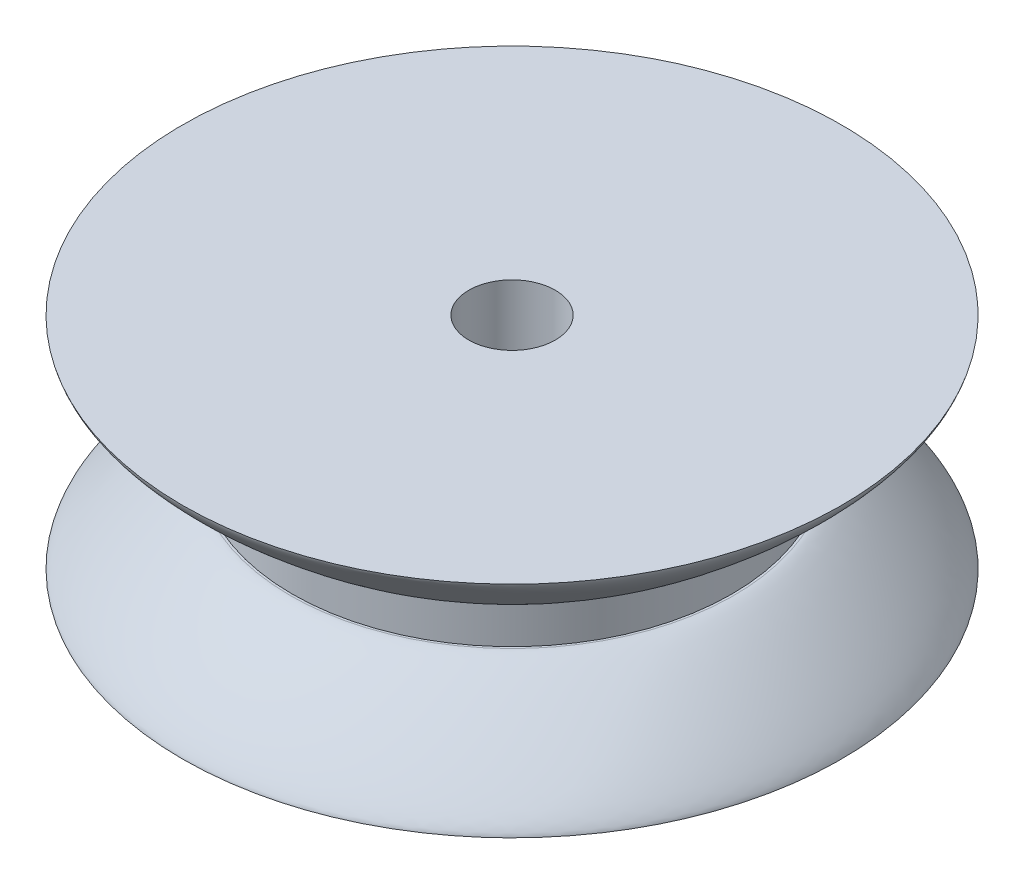
ISO-10303-21;
HEADER;
FILE_DESCRIPTION(('STEP AP214'),'2;1');
FILE_NAME('part.step','',(''),(''),'','','');
FILE_SCHEMA(('AUTOMOTIVE_DESIGN { 1 0 10303 214 1 1 1 1 }'));
ENDSEC;
DATA;
#1=APPLICATION_CONTEXT('core data for automotive mechanical design processes');
#2=APPLICATION_PROTOCOL_DEFINITION('international standard','automotive_design',2000,#1);
#3=PRODUCT_CONTEXT('',#1,'mechanical');
#4=PRODUCT('Part','Part','',(#3));
#5=PRODUCT_RELATED_PRODUCT_CATEGORY('part','',(#4));
#6=PRODUCT_DEFINITION_FORMATION('','',#4);
#7=PRODUCT_DEFINITION_CONTEXT('part definition',#1,'design');
#8=PRODUCT_DEFINITION('design','',#6,#7);
#9=PRODUCT_DEFINITION_SHAPE('','',#8);
#10=(LENGTH_UNIT() NAMED_UNIT(*) SI_UNIT(.MILLI.,.METRE.));
#11=(NAMED_UNIT(*) PLANE_ANGLE_UNIT() SI_UNIT($,.RADIAN.));
#12=(NAMED_UNIT(*) SI_UNIT($,.STERADIAN.) SOLID_ANGLE_UNIT());
#13=UNCERTAINTY_MEASURE_WITH_UNIT(LENGTH_MEASURE(1.E-05),#10,'distance_accuracy_value','');
#14=(GEOMETRIC_REPRESENTATION_CONTEXT(3) GLOBAL_UNCERTAINTY_ASSIGNED_CONTEXT((#13)) GLOBAL_UNIT_ASSIGNED_CONTEXT((#10,
#11,#12)) REPRESENTATION_CONTEXT('',''));
#15=CARTESIAN_POINT('',(0.,0.,0.));
#16=DIRECTION('',(0.,0.,1.));
#17=DIRECTION('',(1.,0.,0.));
#18=AXIS2_PLACEMENT_3D('',#15,#16,#17);
#19=CARTESIAN_POINT('',(0.,5.08,0.));
#20=DIRECTION('',(0.,-1.,0.));
#21=DIRECTION('',(0.,0.,-1.));
#22=AXIS2_PLACEMENT_3D('',#19,#20,#21);
#23=CYLINDRICAL_SURFACE('',#22,1.);
#24=CARTESIAN_POINT('',(0.,5.08,0.));
#25=DIRECTION('',(0.,1.,0.));
#26=DIRECTION('',(0.,0.,1.));
#27=AXIS2_PLACEMENT_3D('',#24,#25,#26);
#28=CIRCLE('',#27,1.);
#29=CARTESIAN_POINT('',(0.,5.08,1.));
#30=VERTEX_POINT('',#29);
#31=EDGE_CURVE('E82',#30,#30,#28,.T.);
#32=ORIENTED_EDGE('',*,*,#31,.T.);
#33=EDGE_LOOP('',(#32));
#34=FACE_BOUND('',#33,.T.);
#35=CARTESIAN_POINT('',(0.,0.,0.));
#36=DIRECTION('',(0.,1.,0.));
#37=DIRECTION('',(0.,0.,1.));
#38=AXIS2_PLACEMENT_3D('',#35,#36,#37);
#39=CIRCLE('',#38,1.);
#40=CARTESIAN_POINT('',(0.,0.,1.));
#41=VERTEX_POINT('',#40);
#42=EDGE_CURVE('E88',#41,#41,#39,.T.);
#43=ORIENTED_EDGE('',*,*,#42,.F.);
#44=EDGE_LOOP('',(#43));
#45=FACE_BOUND('',#44,.T.);
#46=ADVANCED_FACE('F61',(#34,#45),#23,.F.);
#47=CARTESIAN_POINT('',(0.,5.08,0.));
#48=DIRECTION('',(0.,-1.,0.));
#49=DIRECTION('',(0.,0.,-1.));
#50=AXIS2_PLACEMENT_3D('',#47,#48,#49);
#51=CYLINDRICAL_SURFACE('',#50,5.08);
#52=CARTESIAN_POINT('',(0.,3.048,0.));
#53=DIRECTION('',(0.,1.,0.));
#54=DIRECTION('',(0.,0.,1.));
#55=AXIS2_PLACEMENT_3D('',#52,#53,#54);
#56=CIRCLE('',#55,5.08);
#57=CARTESIAN_POINT('',(0.,3.048,5.08));
#58=VERTEX_POINT('',#57);
#59=EDGE_CURVE('E205',#58,#58,#56,.T.);
#60=ORIENTED_EDGE('',*,*,#59,.F.);
#61=EDGE_LOOP('',(#60));
#62=FACE_BOUND('',#61,.T.);
#63=CARTESIAN_POINT('',(0.,2.032,0.));
#64=DIRECTION('',(0.,1.,0.));
#65=DIRECTION('',(0.,0.,1.));
#66=AXIS2_PLACEMENT_3D('',#63,#64,#65);
#67=CIRCLE('',#66,5.08);
#68=CARTESIAN_POINT('',(0.,2.032,5.08));
#69=VERTEX_POINT('',#68);
#70=EDGE_CURVE('E97',#69,#69,#67,.T.);
#71=ORIENTED_EDGE('',*,*,#70,.T.);
#72=EDGE_LOOP('',(#71));
#73=FACE_BOUND('',#72,.T.);
#74=ADVANCED_FACE('F211',(#62,#73),#51,.T.);
#75=CARTESIAN_POINT('',(0.,5.08,0.));
#76=DIRECTION('',(0.,1.,0.));
#77=DIRECTION('',(0.,0.,1.));
#78=AXIS2_PLACEMENT_3D('',#75,#76,#77);
#79=PLANE('',#78);
#80=ORIENTED_EDGE('',*,*,#31,.F.);
#81=EDGE_LOOP('',(#80));
#82=FACE_BOUND('',#81,.T.);
#83=CARTESIAN_POINT('',(0.,5.08,7.62));
#84=CARTESIAN_POINT('',(-0.997455661202278,5.08,7.62));
#85=CARTESIAN_POINT('',(-1.99451888465095,5.08,7.42167179379677));
#86=CARTESIAN_POINT('',(-3.83757662459304,5.08,6.65825228167523));
#87=CARTESIAN_POINT('',(-4.68284601067309,5.08,6.0934613346099));
#88=CARTESIAN_POINT('',(-6.09346133460993,5.08,4.68284601067305));
#89=CARTESIAN_POINT('',(-6.65825228167582,5.08,3.83757662459302));
#90=CARTESIAN_POINT('',(-7.4216717937962,5.08,1.99451888465093));
#91=CARTESIAN_POINT('',(-7.61999999999942,5.08000000000029,0.997455661201066));
#92=CARTESIAN_POINT('',(-7.62000000000058,5.07999999999971,-0.997455661201042));
#93=CARTESIAN_POINT('',(-7.42167179379677,5.08,-1.99451888465066));
#94=CARTESIAN_POINT('',(-6.65825228167523,5.08,-3.83757662459333));
#95=CARTESIAN_POINT('',(-6.09346133461007,5.08,-4.6828460106735));
#96=CARTESIAN_POINT('',(-4.68284601067292,5.08,-6.09346133460948));
#97=CARTESIAN_POINT('',(-3.83757662459366,5.08,-6.65825228167524));
#98=CARTESIAN_POINT('',(-1.99451888465029,5.08,-7.42167179379677));
#99=CARTESIAN_POINT('',(-0.997455661201052,5.08,-7.62));
#100=CARTESIAN_POINT('',(0.997455661201053,5.08,-7.62));
#101=CARTESIAN_POINT('',(1.99451888465045,5.08,-7.42167179379618));
#102=CARTESIAN_POINT('',(3.83757662459354,5.08,-6.65825228167582));
#103=CARTESIAN_POINT('',(4.68284601067291,5.08,-6.0934613346092));
#104=CARTESIAN_POINT('',(6.09346133461006,5.08,-4.6828460106738));
#105=CARTESIAN_POINT('',(6.65825228167538,5.08,-3.83757662459364));
#106=CARTESIAN_POINT('',(7.42167179379663,5.08,-1.99451888465033));
#107=CARTESIAN_POINT('',(7.62,5.08,-0.997455661201052));
#108=CARTESIAN_POINT('',(7.62,5.08,0.997455661201052));
#109=CARTESIAN_POINT('',(7.42167179379692,5.08,1.99451888465091));
#110=CARTESIAN_POINT('',(6.65825228167509,5.08,3.83757662459306));
#111=CARTESIAN_POINT('',(6.09346133460955,5.08,4.68284601067343));
#112=CARTESIAN_POINT('',(4.68284601067343,5.08,6.09346133460955));
#113=CARTESIAN_POINT('',(3.83757662459306,5.08,6.65825228167568));
#114=CARTESIAN_POINT('',(1.99451888465091,5.08,7.42167179379634));
#115=CARTESIAN_POINT('',(0.997455661202277,5.08,7.62));
#116=CARTESIAN_POINT('',(0.,5.08,7.62));
#117=(BOUNDED_CURVE() B_SPLINE_CURVE(3,(#83,#84,#85,#86,#87,#88,#89,#90,#91,#92,#93,#94,#95,#96,
#97,#98,#99,#100,#101,#102,#103,#104,#105,#106,#107,#108,#109,#110,#111,#112,#113,#114,#115,
#116),.UNSPECIFIED.,.T.,.F.) B_SPLINE_CURVE_WITH_KNOTS((4,2,2,2,2,2,2,2,2,2,2,2,2,2,2,2,4),(0.,
0.392699081698725,0.785398163397448,1.17809724509617,1.5707963267949,1.96349540849362,
2.35619449019234,2.74889357189107,3.14159265358979,3.53429173528852,3.92699081698724,
4.31968989868597,4.71238898038469,5.10508806208341,5.49778714378214,5.89048622548086,
6.28318530717959),
.UNSPECIFIED.) CURVE() GEOMETRIC_REPRESENTATION_ITEM() RATIONAL_B_SPLINE_CURVE((1.,1.,1.,1.,1.,
1.,1.,1.,1.,1.,1.,1.,1.,1.,1.,1.,1.,1.,1.,1.,1.,1.,1.,1.,1.,1.,1.,1.,1.,1.,1.,1.,1.,1.)) REPRESENTATION_ITEM(''));
#118=CARTESIAN_POINT('',(0.,5.08,7.62));
#119=VERTEX_POINT('',#118);
#120=EDGE_CURVE('E133',#119,#119,#117,.F.);
#121=ORIENTED_EDGE('',*,*,#120,.T.);
#122=EDGE_LOOP('',(#121));
#123=FACE_BOUND('',#122,.T.);
#124=ADVANCED_FACE('F119',(#82,#123),#79,.T.);
#125=CARTESIAN_POINT('',(0.,0.,0.));
#126=DIRECTION('',(0.,1.,0.));
#127=DIRECTION('',(0.,0.,1.));
#128=AXIS2_PLACEMENT_3D('',#125,#126,#127);
#129=PLANE('',#128);
#130=ORIENTED_EDGE('',*,*,#42,.T.);
#131=EDGE_LOOP('',(#130));
#132=FACE_BOUND('',#131,.T.);
#133=CARTESIAN_POINT('',(0.,0.,7.62));
#134=CARTESIAN_POINT('',(0.997455661201053,0.,7.62));
#135=CARTESIAN_POINT('',(1.99451888465103,0.,7.42167179379618));
#136=CARTESIAN_POINT('',(3.83757662459295,0.,6.65825228167582));
#137=CARTESIAN_POINT('',(4.68284601067291,-1.0923684005759E-13,6.09346133460949));
#138=CARTESIAN_POINT('',(6.09346133461006,1.0923684005759E-13,4.68284601067351));
#139=CARTESIAN_POINT('',(6.65825228167538,0.,3.83757662459335));
#140=CARTESIAN_POINT('',(7.42167179379663,0.,1.99451888465062));
#141=CARTESIAN_POINT('',(7.62,0.,0.997455661201052));
#142=CARTESIAN_POINT('',(7.62,0.,-0.997455661201053));
#143=CARTESIAN_POINT('',(7.42167179379692,1.09128419840217E-13,-1.99451888465047));
#144=CARTESIAN_POINT('',(6.65825228167509,-1.09345260274714E-13,-3.83757662459349));
#145=CARTESIAN_POINT('',(6.09346133460955,0.,-4.68284601067343));
#146=CARTESIAN_POINT('',(4.68284601067343,0.,-6.09346133460955));
#147=CARTESIAN_POINT('',(3.83757662459291,0.,-6.65825228167538));
#148=CARTESIAN_POINT('',(1.99451888465106,0.,-7.42167179379663));
#149=CARTESIAN_POINT('',(0.997455661202278,0.,-7.62));
#150=CARTESIAN_POINT('',(-0.997455661202278,0.,-7.62));
#151=CARTESIAN_POINT('',(-1.99451888464989,0.,-7.42167179379721));
#152=CARTESIAN_POINT('',(-3.83757662459408,0.,-6.6582522816748));
#153=CARTESIAN_POINT('',(-4.6828460106743,0.,-6.09346133460868));
#154=CARTESIAN_POINT('',(-6.09346133460868,0.,-4.68284601067431));
#155=CARTESIAN_POINT('',(-6.6582522816748,-1.09128419840217E-13,-3.83757662459408));
#156=CARTESIAN_POINT('',(-7.42167179379721,1.09345260274714E-13,-1.99451888464989));
#157=CARTESIAN_POINT('',(-7.62,0.,-0.997455661202195));
#158=CARTESIAN_POINT('',(-7.62,0.,0.997455661202184));
#159=CARTESIAN_POINT('',(-7.4216717937972,0.,1.99451888464975));
#160=CARTESIAN_POINT('',(-6.6582522816748,0.,3.83757662459423));
#161=CARTESIAN_POINT('',(-6.09346133460978,0.,4.68284601067321));
#162=CARTESIAN_POINT('',(-4.68284601067321,0.,6.09346133460977));
#163=CARTESIAN_POINT('',(-3.83757662459395,0.,6.65825228167554));
#164=CARTESIAN_POINT('',(-1.99451888465,0.,7.42167179379648));
#165=CARTESIAN_POINT('',(-0.997455661201052,0.,7.62));
#166=CARTESIAN_POINT('',(0.,0.,7.62));
#167=(BOUNDED_CURVE() B_SPLINE_CURVE(3,(#133,#134,#135,#136,#137,#138,#139,#140,#141,#142,#143,
#144,#145,#146,#147,#148,#149,#150,#151,#152,#153,#154,#155,#156,#157,#158,#159,#160,#161,#162,
#163,#164,#165,#166),.UNSPECIFIED.,.T.,.F.) B_SPLINE_CURVE_WITH_KNOTS((4,2,2,2,2,2,2,2,2,2,2,2,
2,2,2,2,4),(-3.14159265358979,-2.74889357189107,-2.35619449019234,-1.96349540849362,
-1.5707963267949,-1.17809724509617,-0.785398163397448,-0.392699081698724,0.,0.392699081698724,
0.785398163397448,1.17809724509617,1.5707963267949,1.96349540849362,2.35619449019234,
2.74889357189107,3.14159265358979),
.UNSPECIFIED.) CURVE() GEOMETRIC_REPRESENTATION_ITEM() RATIONAL_B_SPLINE_CURVE((1.,1.,1.,1.,1.,
1.,1.,1.,1.,1.,1.,1.,1.,1.,1.,1.,1.,1.,1.,1.,1.,1.,1.,1.,1.,1.,1.,1.,1.,1.,1.,1.,1.,1.)) REPRESENTATION_ITEM(''));
#168=CARTESIAN_POINT('',(0.,0.,7.62));
#169=VERTEX_POINT('',#168);
#170=EDGE_CURVE('E94',#169,#169,#167,.T.);
#171=ORIENTED_EDGE('',*,*,#170,.F.);
#172=EDGE_LOOP('',(#171));
#173=FACE_BOUND('',#172,.T.);
#174=ADVANCED_FACE('F118',(#132,#173),#129,.F.);
#175=CARTESIAN_POINT('',(0.,2.032,0.));
#176=DIRECTION('',(0.,1.,0.));
#177=DIRECTION('',(0.,0.,1.));
#178=AXIS2_PLACEMENT_3D('',#175,#176,#177);
#179=PLANE('',#178);
#180=CARTESIAN_POINT('',(0.,2.032,5.13131842133229));
#181=CARTESIAN_POINT('',(-0.671688006401986,2.032,5.13131842133229));
#182=CARTESIAN_POINT('',(-1.34311174468509,2.032,4.99776393603555));
#183=CARTESIAN_POINT('',(-2.58422934738221,2.032,4.48367619249852));
#184=CARTESIAN_POINT('',(-3.15343490798277,2.032,4.10334519631996));
#185=CARTESIAN_POINT('',(-4.10334519632026,2.032,3.15343490798306));
#186=CARTESIAN_POINT('',(-4.48367619249822,2.032,2.58422934738254));
#187=CARTESIAN_POINT('',(-4.99776393603584,2.032,1.34311174468479));
#188=CARTESIAN_POINT('',(-5.13131842133229,2.032,0.671688006402749));
#189=CARTESIAN_POINT('',(-5.13131842133229,2.032,-0.671688006402756));
#190=CARTESIAN_POINT('',(-4.99776393603613,2.032,-1.34311174468493));
#191=CARTESIAN_POINT('',(-4.48367619249793,2.032,-2.58422934738239));
#192=CARTESIAN_POINT('',(-4.10334519631942,2.032,-3.1534349079836));
#193=CARTESIAN_POINT('',(-3.1534349079836,2.032,-4.10334519631943));
#194=CARTESIAN_POINT('',(-2.58422934738238,2.032,-4.48367619249822));
#195=CARTESIAN_POINT('',(-1.34311174468493,2.032,-4.99776393603584));
#196=CARTESIAN_POINT('',(-0.671688006402812,2.032,-5.13131842133229));
#197=CARTESIAN_POINT('',(0.671688006402812,2.032,-5.13131842133229));
#198=CARTESIAN_POINT('',(1.34311174468565,2.032,-4.99776393603555));
#199=CARTESIAN_POINT('',(2.58422934738166,2.032,-4.48367619249851));
#200=CARTESIAN_POINT('',(3.15343490798287,2.032,-4.10334519631986));
#201=CARTESIAN_POINT('',(4.10334519632015,2.032,-3.15343490798316));
#202=CARTESIAN_POINT('',(4.48367619249822,2.032,-2.58422934738195));
#203=CARTESIAN_POINT('',(4.99776393603584,2.032,-1.34311174468536));
#204=CARTESIAN_POINT('',(5.13131842133229,2.032,-0.671688006401987));
#205=CARTESIAN_POINT('',(5.13131842133229,2.032,0.671688006401987));
#206=CARTESIAN_POINT('',(4.99776393603555,2.032,1.34311174468537));
#207=CARTESIAN_POINT('',(4.48367619249851,2.032,2.58422934738195));
#208=CARTESIAN_POINT('',(4.10334519632026,2.032,3.15343490798321));
#209=CARTESIAN_POINT('',(3.15343490798277,2.032,4.10334519631982));
#210=CARTESIAN_POINT('',(2.58422934738179,2.032,4.4836761924988));
#211=CARTESIAN_POINT('',(1.34311174468554,2.032,4.99776393603525));
#212=CARTESIAN_POINT('',(0.671688006401987,2.032,5.13131842133229));
#213=CARTESIAN_POINT('',(0.,2.032,5.13131842133229));
#214=(BOUNDED_CURVE() B_SPLINE_CURVE(3,(#180,#181,#182,#183,#184,#185,#186,#187,#188,#189,#190,
#191,#192,#193,#194,#195,#196,#197,#198,#199,#200,#201,#202,#203,#204,#205,#206,#207,#208,#209,
#210,#211,#212,#213),.UNSPECIFIED.,.T.,.F.) B_SPLINE_CURVE_WITH_KNOTS((4,2,2,2,2,2,2,2,2,2,2,2,
2,2,2,2,4),(-3.14159265358979,-2.74889357189107,-2.35619449019234,-1.96349540849362,
-1.5707963267949,-1.17809724509617,-0.785398163397448,-0.392699081698724,0.,0.392699081698724,
0.785398163397448,1.17809724509617,1.5707963267949,1.96349540849362,2.35619449019234,
2.74889357189107,3.14159265358979),
.UNSPECIFIED.) CURVE() GEOMETRIC_REPRESENTATION_ITEM() RATIONAL_B_SPLINE_CURVE((1.,1.,1.,1.,1.,
1.,1.,1.,1.,1.,1.,1.,1.,1.,1.,1.,1.,1.,1.,1.,1.,1.,1.,1.,1.,1.,1.,1.,1.,1.,1.,1.,1.,1.)) REPRESENTATION_ITEM(''));
#215=CARTESIAN_POINT('',(0.,2.032,5.13131842133229));
#216=VERTEX_POINT('',#215);
#217=EDGE_CURVE('E12',#216,#216,#214,.F.);
#218=ORIENTED_EDGE('',*,*,#217,.T.);
#219=EDGE_LOOP('',(#218));
#220=FACE_BOUND('',#219,.T.);
#221=ORIENTED_EDGE('',*,*,#70,.F.);
#222=EDGE_LOOP('',(#221));
#223=FACE_BOUND('',#222,.T.);
#224=ADVANCED_FACE('F114',(#220,#223),#179,.T.);
#225=CARTESIAN_POINT('',(0.,3.048,0.));
#226=DIRECTION('',(0.,-1.,0.));
#227=DIRECTION('',(0.,0.,1.));
#228=AXIS2_PLACEMENT_3D('',#225,#226,#227);
#229=PLANE('',#228);
#230=CARTESIAN_POINT('',(0.,3.048,5.13131842133229));
#231=CARTESIAN_POINT('',(0.671688006402812,3.048,5.13131842133229));
#232=CARTESIAN_POINT('',(1.34311174468551,3.048,4.99776393603526));
#233=CARTESIAN_POINT('',(2.5842293473818,3.048,4.48367619249881));
#234=CARTESIAN_POINT('',(3.15343490798316,3.048,4.10334519631986));
#235=CARTESIAN_POINT('',(4.10334519631986,3.048,3.15343490798316));
#236=CARTESIAN_POINT('',(4.48367619249822,3.048,2.58422934738165));
#237=CARTESIAN_POINT('',(4.99776393603584,3.048,1.34311174468565));
#238=CARTESIAN_POINT('',(5.13131842133229,3.048,0.671688006401987));
#239=CARTESIAN_POINT('',(5.13131842133229,3.048,-0.671688006401987));
#240=CARTESIAN_POINT('',(4.99776393603555,3.048,-1.34311174468522));
#241=CARTESIAN_POINT('',(4.48367619249851,3.048,-2.58422934738209));
#242=CARTESIAN_POINT('',(4.10334519632026,3.048,-3.15343490798306));
#243=CARTESIAN_POINT('',(3.15343490798277,3.048,-4.10334519631997));
#244=CARTESIAN_POINT('',(2.58422934738208,3.048,-4.4836761924988));
#245=CARTESIAN_POINT('',(1.34311174468525,3.048,-4.99776393603525));
#246=CARTESIAN_POINT('',(0.671688006401987,3.048,-5.13131842133229));
#247=CARTESIAN_POINT('',(-0.671688006401986,3.048,-5.13131842133229));
#248=CARTESIAN_POINT('',(-1.34311174468523,3.048,-4.99776393603555));
#249=CARTESIAN_POINT('',(-2.58422934738206,3.048,-4.48367619249852));
#250=CARTESIAN_POINT('',(-3.15343490798263,3.048,-4.10334519631996));
#251=CARTESIAN_POINT('',(-4.1033451963204,3.048,-3.15343490798306));
#252=CARTESIAN_POINT('',(-4.48367619249851,3.048,-2.58422934738183));
#253=CARTESIAN_POINT('',(-4.99776393603554,3.048,-1.34311174468549));
#254=CARTESIAN_POINT('',(-5.13131842133258,3.048,-0.67168800640198));
#255=CARTESIAN_POINT('',(-5.131318421332,3.048,0.671688006401996));
#256=CARTESIAN_POINT('',(-4.99776393603526,3.048,1.34311174468563));
#257=CARTESIAN_POINT('',(-4.48367619249881,3.048,2.58422934738167));
#258=CARTESIAN_POINT('',(-4.10334519632006,3.048,3.15343490798282));
#259=CARTESIAN_POINT('',(-3.15343490798299,3.048,4.10334519632018));
#260=CARTESIAN_POINT('',(-2.58422934738168,3.048,4.48367619249851));
#261=CARTESIAN_POINT('',(-1.34311174468564,3.048,4.99776393603554));
#262=CARTESIAN_POINT('',(-0.671688006402813,3.048,5.13131842133229));
#263=CARTESIAN_POINT('',(0.,3.048,5.13131842133229));
#264=(BOUNDED_CURVE() B_SPLINE_CURVE(3,(#230,#231,#232,#233,#234,#235,#236,#237,#238,#239,#240,
#241,#242,#243,#244,#245,#246,#247,#248,#249,#250,#251,#252,#253,#254,#255,#256,#257,#258,#259,
#260,#261,#262,#263),.UNSPECIFIED.,.T.,.F.) B_SPLINE_CURVE_WITH_KNOTS((4,2,2,2,2,2,2,2,2,2,2,2,
2,2,2,2,4),(0.,0.392699081698724,0.785398163397448,1.17809724509617,1.5707963267949,
1.96349540849362,2.35619449019234,2.74889357189107,3.14159265358979,3.53429173528852,
3.92699081698724,4.31968989868597,4.71238898038469,5.10508806208341,5.49778714378214,
5.89048622548086,6.28318530717959),
.UNSPECIFIED.) CURVE() GEOMETRIC_REPRESENTATION_ITEM() RATIONAL_B_SPLINE_CURVE((1.,1.,1.,1.,1.,
1.,1.,1.,1.,1.,1.,1.,1.,1.,1.,1.,1.,1.,1.,1.,1.,1.,1.,1.,1.,1.,1.,1.,1.,1.,1.,1.,1.,1.)) REPRESENTATION_ITEM(''));
#265=CARTESIAN_POINT('',(0.,3.048,5.13131842133229));
#266=VERTEX_POINT('',#265);
#267=EDGE_CURVE('E76',#266,#266,#264,.F.);
#268=ORIENTED_EDGE('',*,*,#267,.T.);
#269=EDGE_LOOP('',(#268));
#270=FACE_BOUND('',#269,.T.);
#271=ORIENTED_EDGE('',*,*,#59,.T.);
#272=EDGE_LOOP('',(#271));
#273=FACE_BOUND('',#272,.T.);
#274=ADVANCED_FACE('F104',(#270,#273),#229,.T.);
#275=CARTESIAN_POINT('',(0.,5.08,7.62));
#276=CARTESIAN_POINT('',(0.997455661202277,5.08,7.62));
#277=CARTESIAN_POINT('',(1.99451888465091,5.08,7.42167179379634));
#278=CARTESIAN_POINT('',(3.83757662459306,5.08,6.65825228167568));
#279=CARTESIAN_POINT('',(4.68284601067343,5.08,6.09346133460955));
#280=CARTESIAN_POINT('',(6.09346133460955,5.08,4.68284601067343));
#281=CARTESIAN_POINT('',(6.65825228167509,5.08,3.83757662459306));
#282=CARTESIAN_POINT('',(7.42167179379692,5.08,1.99451888465091));
#283=CARTESIAN_POINT('',(7.62,5.08,0.997455661201052));
#284=CARTESIAN_POINT('',(7.62,5.08,-0.997455661201052));
#285=CARTESIAN_POINT('',(7.42167179379663,5.08,-1.99451888465033));
#286=CARTESIAN_POINT('',(6.65825228167538,5.08,-3.83757662459364));
#287=CARTESIAN_POINT('',(6.09346133461006,5.08,-4.6828460106738));
#288=CARTESIAN_POINT('',(4.68284601067291,5.08,-6.0934613346092));
#289=CARTESIAN_POINT('',(3.83757662459354,5.08,-6.65825228167582));
#290=CARTESIAN_POINT('',(1.99451888465045,5.08,-7.42167179379618));
#291=CARTESIAN_POINT('',(0.997455661201053,5.08,-7.62));
#292=CARTESIAN_POINT('',(-0.997455661201052,5.08,-7.62));
#293=CARTESIAN_POINT('',(-1.99451888465029,5.08,-7.42167179379677));
#294=CARTESIAN_POINT('',(-3.83757662459366,5.08,-6.65825228167524));
#295=CARTESIAN_POINT('',(-4.68284601067292,5.08,-6.09346133460948));
#296=CARTESIAN_POINT('',(-6.09346133461007,5.08,-4.6828460106735));
#297=CARTESIAN_POINT('',(-6.65825228167523,5.08,-3.83757662459333));
#298=CARTESIAN_POINT('',(-7.42167179379677,5.08,-1.99451888465066));
#299=CARTESIAN_POINT('',(-7.62000000000058,5.07999999999971,-0.997455661201042));
#300=CARTESIAN_POINT('',(-7.61999999999942,5.08000000000029,0.997455661201066));
#301=CARTESIAN_POINT('',(-7.4216717937962,5.08,1.99451888465093));
#302=CARTESIAN_POINT('',(-6.65825228167582,5.08,3.83757662459302));
#303=CARTESIAN_POINT('',(-6.09346133460993,5.08,4.68284601067305));
#304=CARTESIAN_POINT('',(-4.68284601067309,5.08,6.0934613346099));
#305=CARTESIAN_POINT('',(-3.83757662459304,5.08,6.65825228167523));
#306=CARTESIAN_POINT('',(-1.99451888465095,5.08,7.42167179379677));
#307=CARTESIAN_POINT('',(-0.997455661202278,5.08,7.62));
#308=CARTESIAN_POINT('',(0.,5.08,7.62));
#309=CARTESIAN_POINT('',(0.,3.048,7.20521973688872));
#310=CARTESIAN_POINT('',(0.943161052069033,3.048,7.20521973688872));
#311=CARTESIAN_POINT('',(1.88595102799006,3.048,7.01768715083645));
#312=CARTESIAN_POINT('',(3.62868541172447,3.048,6.29582293347924));
#313=CARTESIAN_POINT('',(4.42794416022513,3.048,5.7617753115612));
#314=CARTESIAN_POINT('',(5.7617753115612,3.048,4.42794416022513));
#315=CARTESIAN_POINT('',(6.29582293347924,3.048,3.62868541172447));
#316=CARTESIAN_POINT('',(7.01768715083645,3.048,1.88595102799006));
#317=CARTESIAN_POINT('',(7.20521973688872,3.048,0.943161052067875));
#318=CARTESIAN_POINT('',(7.20521973688872,3.048,-0.943161052067874));
#319=CARTESIAN_POINT('',(7.01768715083645,3.048,-1.88595102798948));
#320=CARTESIAN_POINT('',(6.29582293347924,3.048,-3.62868541172505));
#321=CARTESIAN_POINT('',(5.76177531156195,3.048,-4.42794416022554));
#322=CARTESIAN_POINT('',(4.42794416022436,3.048,-5.7617753115608));
#323=CARTESIAN_POINT('',(3.62868541172503,3.04800000000015,-6.2958229334797));
#324=CARTESIAN_POINT('',(1.88595102798951,3.04799999999985,-7.01768715083598));
#325=CARTESIAN_POINT('',(0.943161052067876,3.048,-7.20521973688872));
#326=CARTESIAN_POINT('',(-0.943161052067874,3.048,-7.20521973688872));
#327=CARTESIAN_POINT('',(-1.88595102798935,3.048,-7.01768715083657));
#328=CARTESIAN_POINT('',(-3.62868541172516,3.048,-6.29582293347912));
#329=CARTESIAN_POINT('',(-4.42794416022466,3.048,-5.76177531156137));
#330=CARTESIAN_POINT('',(-5.76177531156167,3.048,-4.42794416022495));
#331=CARTESIAN_POINT('',(-6.29582293347877,3.048,-3.62868541172479));
#332=CARTESIAN_POINT('',(-7.01768715083691,3.048,-1.88595102798975));
#333=CARTESIAN_POINT('',(-7.2052197368893,3.04799999999985,-0.943161052067864));
#334=CARTESIAN_POINT('',(-7.20521973688813,3.04800000000015,0.943161052067887));
#335=CARTESIAN_POINT('',(-7.01768715083604,3.048,1.88595102799017));
#336=CARTESIAN_POINT('',(-6.29582293347965,3.048,3.62868541172434));
#337=CARTESIAN_POINT('',(-5.76177531156162,3.04799999999985,4.42794416022471));
#338=CARTESIAN_POINT('',(-4.42794416022474,3.04800000000015,5.76177531156159));
#339=CARTESIAN_POINT('',(-3.6286854117245,3.048,6.29582293347877));
#340=CARTESIAN_POINT('',(-1.88595102799004,3.048,7.01768715083691));
#341=CARTESIAN_POINT('',(-0.943161052069034,3.048,7.20521973688872));
#342=CARTESIAN_POINT('',(0.,3.048,7.20521973688872));
#343=CARTESIAN_POINT('',(0.,3.048,5.13131842133229));
#344=CARTESIAN_POINT('',(0.671688006402812,3.048,5.13131842133229));
#345=CARTESIAN_POINT('',(1.34311174468551,3.048,4.99776393603526));
#346=CARTESIAN_POINT('',(2.5842293473818,3.048,4.48367619249881));
#347=CARTESIAN_POINT('',(3.15343490798316,3.048,4.10334519631986));
#348=CARTESIAN_POINT('',(4.10334519631986,3.048,3.15343490798316));
#349=CARTESIAN_POINT('',(4.48367619249822,3.048,2.58422934738165));
#350=CARTESIAN_POINT('',(4.99776393603584,3.048,1.34311174468565));
#351=CARTESIAN_POINT('',(5.13131842133229,3.048,0.671688006401987));
#352=CARTESIAN_POINT('',(5.13131842133229,3.048,-0.671688006401987));
#353=CARTESIAN_POINT('',(4.99776393603555,3.048,-1.34311174468522));
#354=CARTESIAN_POINT('',(4.48367619249851,3.048,-2.58422934738209));
#355=CARTESIAN_POINT('',(4.10334519632026,3.048,-3.15343490798306));
#356=CARTESIAN_POINT('',(3.15343490798277,3.048,-4.10334519631997));
#357=CARTESIAN_POINT('',(2.58422934738208,3.048,-4.4836761924988));
#358=CARTESIAN_POINT('',(1.34311174468525,3.048,-4.99776393603525));
#359=CARTESIAN_POINT('',(0.671688006401987,3.048,-5.13131842133229));
#360=CARTESIAN_POINT('',(-0.671688006401986,3.048,-5.13131842133229));
#361=CARTESIAN_POINT('',(-1.34311174468523,3.048,-4.99776393603555));
#362=CARTESIAN_POINT('',(-2.58422934738206,3.048,-4.48367619249852));
#363=CARTESIAN_POINT('',(-3.15343490798263,3.048,-4.10334519631996));
#364=CARTESIAN_POINT('',(-4.1033451963204,3.048,-3.15343490798306));
#365=CARTESIAN_POINT('',(-4.48367619249851,3.048,-2.58422934738183));
#366=CARTESIAN_POINT('',(-4.99776393603554,3.048,-1.34311174468549));
#367=CARTESIAN_POINT('',(-5.13131842133258,3.048,-0.67168800640198));
#368=CARTESIAN_POINT('',(-5.131318421332,3.048,0.671688006401996));
#369=CARTESIAN_POINT('',(-4.99776393603526,3.048,1.34311174468563));
#370=CARTESIAN_POINT('',(-4.48367619249881,3.048,2.58422934738167));
#371=CARTESIAN_POINT('',(-4.10334519632006,3.048,3.15343490798282));
#372=CARTESIAN_POINT('',(-3.15343490798299,3.048,4.10334519632018));
#373=CARTESIAN_POINT('',(-2.58422934738168,3.048,4.48367619249851));
#374=CARTESIAN_POINT('',(-1.34311174468564,3.048,4.99776393603554));
#375=CARTESIAN_POINT('',(-0.671688006402813,3.048,5.13131842133229));
#376=CARTESIAN_POINT('',(0.,3.048,5.13131842133229));
#377=(BOUNDED_SURFACE() B_SPLINE_SURFACE(2,3,((#275,#276,#277,#278,#279,#280,#281,#282,#283,
#284,#285,#286,#287,#288,#289,#290,#291,#292,#293,#294,#295,#296,#297,#298,#299,#300,#301,#302,
#303,#304,#305,#306,#307,#308),(#309,#310,#311,#312,#313,#314,#315,#316,#317,#318,#319,#320,
#321,#322,#323,#324,#325,#326,#327,#328,#329,#330,#331,#332,#333,#334,#335,#336,#337,#338,#339,
#340,#341,#342),(#343,#344,#345,#346,#347,#348,#349,#350,#351,#352,#353,#354,#355,#356,#357,
#358,#359,#360,#361,#362,#363,#364,#365,#366,#367,#368,#369,#370,#371,#372,#373,#374,#375,
#376)),.UNSPECIFIED.,.F.,.T.,.F.) B_SPLINE_SURFACE_WITH_KNOTS((3,3),(4,2,2,2,2,2,2,2,2,2,2,2,2,
2,2,2,4),(0.,1.),(0.,0.392699081698724,0.785398163397448,1.17809724509617,1.5707963267949,
1.96349540849362,2.35619449019234,2.74889357189107,3.14159265358979,3.53429173528852,
3.92699081698724,4.31968989868597,4.71238898038469,5.10508806208341,5.49778714378214,
5.89048622548086,6.28318530717959),
.UNSPECIFIED.) GEOMETRIC_REPRESENTATION_ITEM() RATIONAL_B_SPLINE_SURFACE(((1.,1.,1.,1.,1.,1.,1.,
1.,1.,1.,1.,1.,1.,1.,1.,1.,1.,1.,1.,1.,1.,1.,1.,1.,1.,1.,1.,1.,1.,1.,1.,1.,1.,1.),
(0.176470588235294,0.176470588235294,0.176470588235294,0.176470588235294,0.176470588235294,
0.176470588235294,0.176470588235294,0.176470588235294,0.176470588235294,0.176470588235294,
0.176470588235294,0.176470588235294,0.176470588235294,0.176470588235294,0.176470588235294,
0.176470588235294,0.176470588235294,0.176470588235294,0.176470588235294,0.176470588235294,
0.176470588235294,0.176470588235294,0.176470588235294,0.176470588235294,0.176470588235294,
0.176470588235294,0.176470588235294,0.176470588235294,0.176470588235294,0.176470588235294,
0.176470588235294,0.176470588235294,0.176470588235294,0.176470588235294),(1.,1.,1.,1.,1.,1.,1.,
1.,1.,1.,1.,1.,1.,1.,1.,1.,1.,1.,1.,1.,1.,1.,1.,1.,1.,1.,1.,1.,1.,1.,1.,1.,1.,1.))) REPRESENTATION_ITEM('') SURFACE());
#378=ORIENTED_EDGE('',*,*,#267,.F.);
#379=EDGE_LOOP('',(#378));
#380=FACE_BOUND('',#379,.T.);
#381=ORIENTED_EDGE('',*,*,#120,.F.);
#382=EDGE_LOOP('',(#381));
#383=FACE_BOUND('',#382,.T.);
#384=ADVANCED_FACE('F113',(#380,#383),#377,.T.);
#385=CARTESIAN_POINT('',(0.,0.,7.62));
#386=CARTESIAN_POINT('',(-0.997455661201052,0.,7.62));
#387=CARTESIAN_POINT('',(-1.99451888465,0.,7.42167179379648));
#388=CARTESIAN_POINT('',(-3.83757662459395,0.,6.65825228167554));
#389=CARTESIAN_POINT('',(-4.68284601067321,0.,6.09346133460977));
#390=CARTESIAN_POINT('',(-6.09346133460978,0.,4.68284601067321));
#391=CARTESIAN_POINT('',(-6.6582522816748,0.,3.83757662459423));
#392=CARTESIAN_POINT('',(-7.4216717937972,0.,1.99451888464975));
#393=CARTESIAN_POINT('',(-7.62,0.,0.997455661202184));
#394=CARTESIAN_POINT('',(-7.62,0.,-0.997455661202195));
#395=CARTESIAN_POINT('',(-7.42167179379721,1.09345260274714E-13,-1.99451888464989));
#396=CARTESIAN_POINT('',(-6.6582522816748,-1.09128419840217E-13,-3.83757662459408));
#397=CARTESIAN_POINT('',(-6.09346133460868,0.,-4.68284601067431));
#398=CARTESIAN_POINT('',(-4.6828460106743,0.,-6.09346133460868));
#399=CARTESIAN_POINT('',(-3.83757662459408,0.,-6.6582522816748));
#400=CARTESIAN_POINT('',(-1.99451888464989,0.,-7.42167179379721));
#401=CARTESIAN_POINT('',(-0.997455661202278,0.,-7.62));
#402=CARTESIAN_POINT('',(0.997455661202278,0.,-7.62));
#403=CARTESIAN_POINT('',(1.99451888465106,0.,-7.42167179379663));
#404=CARTESIAN_POINT('',(3.83757662459291,0.,-6.65825228167538));
#405=CARTESIAN_POINT('',(4.68284601067343,0.,-6.09346133460955));
#406=CARTESIAN_POINT('',(6.09346133460955,0.,-4.68284601067343));
#407=CARTESIAN_POINT('',(6.65825228167509,-1.09345260274714E-13,-3.83757662459349));
#408=CARTESIAN_POINT('',(7.42167179379692,1.09128419840217E-13,-1.99451888465047));
#409=CARTESIAN_POINT('',(7.62,0.,-0.997455661201053));
#410=CARTESIAN_POINT('',(7.62,0.,0.997455661201052));
#411=CARTESIAN_POINT('',(7.42167179379663,0.,1.99451888465062));
#412=CARTESIAN_POINT('',(6.65825228167538,0.,3.83757662459335));
#413=CARTESIAN_POINT('',(6.09346133461006,1.0923684005759E-13,4.68284601067351));
#414=CARTESIAN_POINT('',(4.68284601067291,-1.0923684005759E-13,6.09346133460949));
#415=CARTESIAN_POINT('',(3.83757662459295,0.,6.65825228167582));
#416=CARTESIAN_POINT('',(1.99451888465103,0.,7.42167179379618));
#417=CARTESIAN_POINT('',(0.997455661201053,0.,7.62));
#418=CARTESIAN_POINT('',(0.,0.,7.62));
#419=CARTESIAN_POINT('',(0.,2.032,7.20521973688872));
#420=CARTESIAN_POINT('',(-0.943161052067874,2.032,7.20521973688872));
#421=CARTESIAN_POINT('',(-1.88595102798906,2.032,7.01768715083628));
#422=CARTESIAN_POINT('',(-3.62868541172545,2.032,6.29582293347941));
#423=CARTESIAN_POINT('',(-4.42794416022495,2.03200000000015,5.76177531156166));
#424=CARTESIAN_POINT('',(-5.76177531156138,2.03199999999985,4.42794416022465));
#425=CARTESIAN_POINT('',(-6.29582293347836,2.03199999999985,3.6286854117255));
#426=CARTESIAN_POINT('',(-7.01768715083731,2.03200000000015,1.88595102798905));
#427=CARTESIAN_POINT('',(-7.20521973688872,2.032,0.943161052068945));
#428=CARTESIAN_POINT('',(-7.20521973688872,2.032,-0.943161052068955));
#429=CARTESIAN_POINT('',(-7.01768715083674,2.032,-1.88595102798889));
#430=CARTESIAN_POINT('',(-6.29582293347895,2.032,-3.62868541172563));
#431=CARTESIAN_POINT('',(-5.76177531156061,2.032,-4.427944160226));
#432=CARTESIAN_POINT('',(-4.42794416022571,2.032,-5.76177531156033));
#433=CARTESIAN_POINT('',(-3.62868541172563,2.032,-6.29582293347866));
#434=CARTESIAN_POINT('',(-1.88595102798889,2.032,-7.01768715083703));
#435=CARTESIAN_POINT('',(-0.943161052069034,2.032,-7.20521973688872));
#436=CARTESIAN_POINT('',(0.943161052069034,2.032,-7.20521973688872));
#437=CARTESIAN_POINT('',(1.88595102799006,2.03199999999985,-7.01768715083645));
#438=CARTESIAN_POINT('',(3.62868541172447,2.03200000000015,-6.29582293347924));
#439=CARTESIAN_POINT('',(4.42794416022513,2.032,-5.7617753115612));
#440=CARTESIAN_POINT('',(5.7617753115612,2.032,-4.42794416022513));
#441=CARTESIAN_POINT('',(6.29582293347924,2.032,-3.62868541172505));
#442=CARTESIAN_POINT('',(7.01768715083645,2.032,-1.88595102798947));
#443=CARTESIAN_POINT('',(7.20521973688872,2.032,-0.943161052067875));
#444=CARTESIAN_POINT('',(7.20521973688872,2.032,0.943161052067874));
#445=CARTESIAN_POINT('',(7.01768715083615,2.03199999999985,1.88595102798962));
#446=CARTESIAN_POINT('',(6.29582293347953,2.03200000000015,3.62868541172491));
#447=CARTESIAN_POINT('',(5.76177531156195,2.03199999999985,4.42794416022524));
#448=CARTESIAN_POINT('',(4.42794416022436,2.03200000000015,5.76177531156109));
#449=CARTESIAN_POINT('',(3.62868541172445,2.03200000000015,6.2958229334797));
#450=CARTESIAN_POINT('',(1.88595102799009,2.03199999999985,7.01768715083598));
#451=CARTESIAN_POINT('',(0.943161052067876,2.032,7.20521973688872));
#452=CARTESIAN_POINT('',(0.,2.032,7.20521973688872));
#453=CARTESIAN_POINT('',(0.,2.032,5.13131842133229));
#454=CARTESIAN_POINT('',(-0.671688006401986,2.032,5.13131842133229));
#455=CARTESIAN_POINT('',(-1.34311174468509,2.032,4.99776393603555));
#456=CARTESIAN_POINT('',(-2.58422934738221,2.032,4.48367619249852));
#457=CARTESIAN_POINT('',(-3.15343490798277,2.032,4.10334519631996));
#458=CARTESIAN_POINT('',(-4.10334519632026,2.032,3.15343490798306));
#459=CARTESIAN_POINT('',(-4.48367619249822,2.032,2.58422934738254));
#460=CARTESIAN_POINT('',(-4.99776393603584,2.032,1.34311174468479));
#461=CARTESIAN_POINT('',(-5.13131842133229,2.032,0.671688006402749));
#462=CARTESIAN_POINT('',(-5.13131842133229,2.032,-0.671688006402756));
#463=CARTESIAN_POINT('',(-4.99776393603613,2.032,-1.34311174468493));
#464=CARTESIAN_POINT('',(-4.48367619249793,2.032,-2.58422934738239));
#465=CARTESIAN_POINT('',(-4.10334519631942,2.032,-3.1534349079836));
#466=CARTESIAN_POINT('',(-3.1534349079836,2.032,-4.10334519631943));
#467=CARTESIAN_POINT('',(-2.58422934738238,2.032,-4.48367619249822));
#468=CARTESIAN_POINT('',(-1.34311174468493,2.032,-4.99776393603584));
#469=CARTESIAN_POINT('',(-0.671688006402812,2.032,-5.13131842133229));
#470=CARTESIAN_POINT('',(0.671688006402812,2.032,-5.13131842133229));
#471=CARTESIAN_POINT('',(1.34311174468565,2.032,-4.99776393603555));
#472=CARTESIAN_POINT('',(2.58422934738166,2.032,-4.48367619249851));
#473=CARTESIAN_POINT('',(3.15343490798287,2.032,-4.10334519631986));
#474=CARTESIAN_POINT('',(4.10334519632015,2.032,-3.15343490798316));
#475=CARTESIAN_POINT('',(4.48367619249822,2.032,-2.58422934738195));
#476=CARTESIAN_POINT('',(4.99776393603584,2.032,-1.34311174468536));
#477=CARTESIAN_POINT('',(5.13131842133229,2.032,-0.671688006401987));
#478=CARTESIAN_POINT('',(5.13131842133229,2.032,0.671688006401987));
#479=CARTESIAN_POINT('',(4.99776393603555,2.032,1.34311174468537));
#480=CARTESIAN_POINT('',(4.48367619249851,2.032,2.58422934738195));
#481=CARTESIAN_POINT('',(4.10334519632026,2.032,3.15343490798321));
#482=CARTESIAN_POINT('',(3.15343490798277,2.032,4.10334519631982));
#483=CARTESIAN_POINT('',(2.58422934738179,2.032,4.4836761924988));
#484=CARTESIAN_POINT('',(1.34311174468554,2.032,4.99776393603525));
#485=CARTESIAN_POINT('',(0.671688006401987,2.032,5.13131842133229));
#486=CARTESIAN_POINT('',(0.,2.032,5.13131842133229));
#487=(BOUNDED_SURFACE() B_SPLINE_SURFACE(2,3,((#385,#386,#387,#388,#389,#390,#391,#392,#393,
#394,#395,#396,#397,#398,#399,#400,#401,#402,#403,#404,#405,#406,#407,#408,#409,#410,#411,#412,
#413,#414,#415,#416,#417,#418),(#419,#420,#421,#422,#423,#424,#425,#426,#427,#428,#429,#430,
#431,#432,#433,#434,#435,#436,#437,#438,#439,#440,#441,#442,#443,#444,#445,#446,#447,#448,#449,
#450,#451,#452),(#453,#454,#455,#456,#457,#458,#459,#460,#461,#462,#463,#464,#465,#466,#467,
#468,#469,#470,#471,#472,#473,#474,#475,#476,#477,#478,#479,#480,#481,#482,#483,#484,#485,
#486)),.UNSPECIFIED.,.F.,.T.,.F.) B_SPLINE_SURFACE_WITH_KNOTS((3,3),(4,2,2,2,2,2,2,2,2,2,2,2,2,
2,2,2,4),(0.,1.),(-3.14159265358979,-2.74889357189107,-2.35619449019234,-1.96349540849362,
-1.5707963267949,-1.17809724509617,-0.785398163397448,-0.392699081698724,0.,0.392699081698724,
0.785398163397448,1.17809724509617,1.5707963267949,1.96349540849362,2.35619449019234,
2.74889357189107,3.14159265358979),
.UNSPECIFIED.) GEOMETRIC_REPRESENTATION_ITEM() RATIONAL_B_SPLINE_SURFACE(((1.,1.,1.,1.,1.,1.,1.,
1.,1.,1.,1.,1.,1.,1.,1.,1.,1.,1.,1.,1.,1.,1.,1.,1.,1.,1.,1.,1.,1.,1.,1.,1.,1.,1.),
(0.176470588235294,0.176470588235294,0.176470588235294,0.176470588235294,0.176470588235294,
0.176470588235294,0.176470588235294,0.176470588235294,0.176470588235294,0.176470588235294,
0.176470588235294,0.176470588235294,0.176470588235294,0.176470588235294,0.176470588235294,
0.176470588235294,0.176470588235294,0.176470588235294,0.176470588235294,0.176470588235294,
0.176470588235294,0.176470588235294,0.176470588235294,0.176470588235294,0.176470588235294,
0.176470588235294,0.176470588235294,0.176470588235294,0.176470588235294,0.176470588235294,
0.176470588235294,0.176470588235294,0.176470588235294,0.176470588235294),(1.,1.,1.,1.,1.,1.,1.,
1.,1.,1.,1.,1.,1.,1.,1.,1.,1.,1.,1.,1.,1.,1.,1.,1.,1.,1.,1.,1.,1.,1.,1.,1.,1.,1.))) REPRESENTATION_ITEM('') SURFACE());
#488=ORIENTED_EDGE('',*,*,#170,.T.);
#489=EDGE_LOOP('',(#488));
#490=FACE_BOUND('',#489,.T.);
#491=ORIENTED_EDGE('',*,*,#217,.F.);
#492=EDGE_LOOP('',(#491));
#493=FACE_BOUND('',#492,.T.);
#494=ADVANCED_FACE('F64',(#490,#493),#487,.T.);
#495=CLOSED_SHELL('',(#46,#74,#124,#174,#224,#274,#384,#494));
#496=MANIFOLD_SOLID_BREP('B2',#495);
#497=ADVANCED_BREP_SHAPE_REPRESENTATION('',(#18,#496),#14);
#498=SHAPE_DEFINITION_REPRESENTATION(#9,#497);
ENDSEC;
END-ISO-10303-21;
